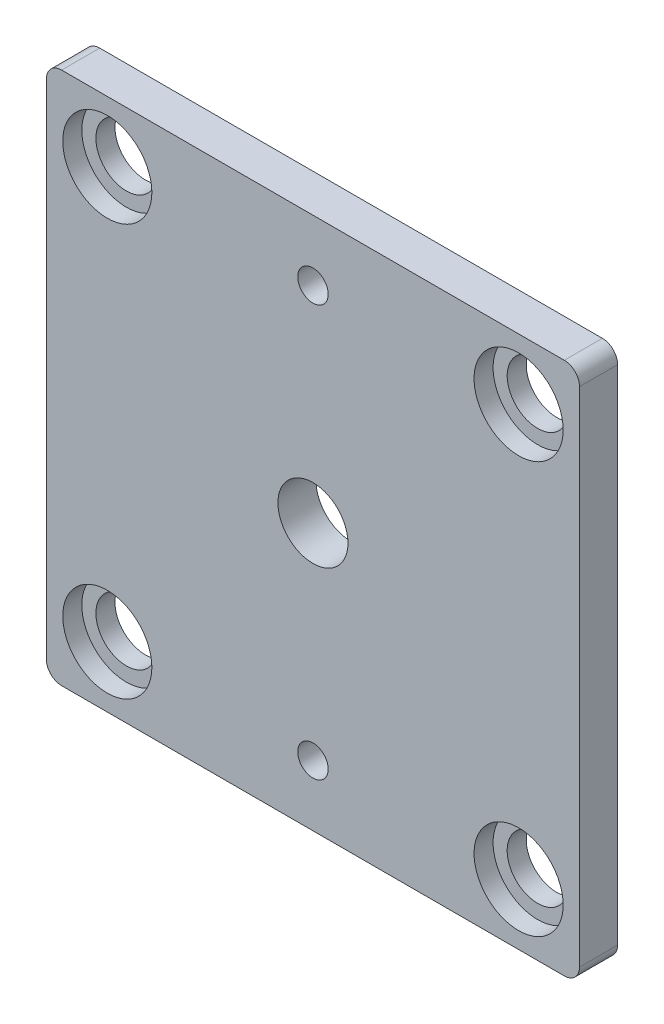
ISO-10303-21;
HEADER;
FILE_DESCRIPTION(('STEP AP214'),'2;1');
FILE_NAME('part.step','',(''),(''),'','','');
FILE_SCHEMA(('AUTOMOTIVE_DESIGN { 1 0 10303 214 1 1 1 1 }'));
ENDSEC;
DATA;
#1=APPLICATION_CONTEXT('core data for automotive mechanical design processes');
#2=APPLICATION_PROTOCOL_DEFINITION('international standard','automotive_design',2000,#1);
#3=PRODUCT_CONTEXT('',#1,'mechanical');
#4=PRODUCT('Part','Part','',(#3));
#5=PRODUCT_RELATED_PRODUCT_CATEGORY('part','',(#4));
#6=PRODUCT_DEFINITION_FORMATION('','',#4);
#7=PRODUCT_DEFINITION_CONTEXT('part definition',#1,'design');
#8=PRODUCT_DEFINITION('design','',#6,#7);
#9=PRODUCT_DEFINITION_SHAPE('','',#8);
#10=(LENGTH_UNIT() NAMED_UNIT(*) SI_UNIT(.MILLI.,.METRE.));
#11=(NAMED_UNIT(*) PLANE_ANGLE_UNIT() SI_UNIT($,.RADIAN.));
#12=(NAMED_UNIT(*) SI_UNIT($,.STERADIAN.) SOLID_ANGLE_UNIT());
#13=UNCERTAINTY_MEASURE_WITH_UNIT(LENGTH_MEASURE(1.E-05),#10,'distance_accuracy_value','');
#14=(GEOMETRIC_REPRESENTATION_CONTEXT(3) GLOBAL_UNCERTAINTY_ASSIGNED_CONTEXT((#13)) GLOBAL_UNIT_ASSIGNED_CONTEXT((#10,
#11,#12)) REPRESENTATION_CONTEXT('',''));
#15=CARTESIAN_POINT('',(0.,0.,0.));
#16=DIRECTION('',(0.,0.,1.));
#17=DIRECTION('',(1.,0.,0.));
#18=AXIS2_PLACEMENT_3D('',#15,#16,#17);
#19=CARTESIAN_POINT('',(-27.,27.,5.));
#20=DIRECTION('',(0.,0.,-1.));
#21=DIRECTION('',(-1.,0.,0.));
#22=AXIS2_PLACEMENT_3D('',#19,#20,#21);
#23=CYLINDRICAL_SURFACE('',#22,4.);
#24=CARTESIAN_POINT('',(-27.,27.,0.));
#25=DIRECTION('',(0.,0.,1.));
#26=DIRECTION('',(1.,0.,0.));
#27=AXIS2_PLACEMENT_3D('',#24,#25,#26);
#28=CIRCLE('',#27,4.);
#29=CARTESIAN_POINT('',(-23.,27.,0.));
#30=VERTEX_POINT('',#29);
#31=EDGE_CURVE('E219',#30,#30,#28,.T.);
#32=ORIENTED_EDGE('',*,*,#31,.F.);
#33=EDGE_LOOP('',(#32));
#34=FACE_BOUND('',#33,.T.);
#35=CARTESIAN_POINT('',(-27.,27.,2.5));
#36=DIRECTION('',(0.,0.,1.));
#37=DIRECTION('',(1.,0.,0.));
#38=AXIS2_PLACEMENT_3D('',#35,#36,#37);
#39=CIRCLE('',#38,4.);
#40=CARTESIAN_POINT('',(-23.,27.,2.5));
#41=VERTEX_POINT('',#40);
#42=EDGE_CURVE('E43',#41,#41,#39,.T.);
#43=ORIENTED_EDGE('',*,*,#42,.T.);
#44=EDGE_LOOP('',(#43));
#45=FACE_BOUND('',#44,.T.);
#46=ADVANCED_FACE('F39',(#34,#45),#23,.F.);
#47=CARTESIAN_POINT('',(27.,27.,5.));
#48=DIRECTION('',(0.,0.,-1.));
#49=DIRECTION('',(-1.,0.,0.));
#50=AXIS2_PLACEMENT_3D('',#47,#48,#49);
#51=CYLINDRICAL_SURFACE('',#50,4.);
#52=CARTESIAN_POINT('',(27.,27.,0.));
#53=DIRECTION('',(0.,0.,1.));
#54=DIRECTION('',(1.,0.,0.));
#55=AXIS2_PLACEMENT_3D('',#52,#53,#54);
#56=CIRCLE('',#55,4.);
#57=CARTESIAN_POINT('',(31.,27.,0.));
#58=VERTEX_POINT('',#57);
#59=EDGE_CURVE('E210',#58,#58,#56,.T.);
#60=ORIENTED_EDGE('',*,*,#59,.F.);
#61=EDGE_LOOP('',(#60));
#62=FACE_BOUND('',#61,.T.);
#63=CARTESIAN_POINT('',(27.,27.,2.5));
#64=DIRECTION('',(0.,0.,1.));
#65=DIRECTION('',(1.,0.,0.));
#66=AXIS2_PLACEMENT_3D('',#63,#64,#65);
#67=CIRCLE('',#66,4.);
#68=CARTESIAN_POINT('',(31.,27.,2.5));
#69=VERTEX_POINT('',#68);
#70=EDGE_CURVE('E192',#69,#69,#67,.T.);
#71=ORIENTED_EDGE('',*,*,#70,.T.);
#72=EDGE_LOOP('',(#71));
#73=FACE_BOUND('',#72,.T.);
#74=ADVANCED_FACE('F287',(#62,#73),#51,.F.);
#75=CARTESIAN_POINT('',(27.,-27.,5.));
#76=DIRECTION('',(0.,0.,-1.));
#77=DIRECTION('',(-1.,0.,0.));
#78=AXIS2_PLACEMENT_3D('',#75,#76,#77);
#79=CYLINDRICAL_SURFACE('',#78,4.);
#80=CARTESIAN_POINT('',(27.,-27.,0.));
#81=DIRECTION('',(0.,0.,1.));
#82=DIRECTION('',(1.,0.,0.));
#83=AXIS2_PLACEMENT_3D('',#80,#81,#82);
#84=CIRCLE('',#83,4.);
#85=CARTESIAN_POINT('',(31.,-27.,0.));
#86=VERTEX_POINT('',#85);
#87=EDGE_CURVE('E204',#86,#86,#84,.T.);
#88=ORIENTED_EDGE('',*,*,#87,.F.);
#89=EDGE_LOOP('',(#88));
#90=FACE_BOUND('',#89,.T.);
#91=CARTESIAN_POINT('',(27.,-27.,2.5));
#92=DIRECTION('',(0.,0.,1.));
#93=DIRECTION('',(1.,0.,0.));
#94=AXIS2_PLACEMENT_3D('',#91,#92,#93);
#95=CIRCLE('',#94,4.);
#96=CARTESIAN_POINT('',(31.,-27.,2.5));
#97=VERTEX_POINT('',#96);
#98=EDGE_CURVE('E188',#97,#97,#95,.T.);
#99=ORIENTED_EDGE('',*,*,#98,.T.);
#100=EDGE_LOOP('',(#99));
#101=FACE_BOUND('',#100,.T.);
#102=ADVANCED_FACE('F293',(#90,#101),#79,.F.);
#103=CARTESIAN_POINT('',(-27.,-27.,5.));
#104=DIRECTION('',(0.,0.,-1.));
#105=DIRECTION('',(-1.,0.,0.));
#106=AXIS2_PLACEMENT_3D('',#103,#104,#105);
#107=CYLINDRICAL_SURFACE('',#106,4.);
#108=CARTESIAN_POINT('',(-27.,-27.,0.));
#109=DIRECTION('',(0.,0.,1.));
#110=DIRECTION('',(1.,0.,0.));
#111=AXIS2_PLACEMENT_3D('',#108,#109,#110);
#112=CIRCLE('',#111,4.);
#113=CARTESIAN_POINT('',(-23.,-27.,0.));
#114=VERTEX_POINT('',#113);
#115=EDGE_CURVE('E199',#114,#114,#112,.T.);
#116=ORIENTED_EDGE('',*,*,#115,.F.);
#117=EDGE_LOOP('',(#116));
#118=FACE_BOUND('',#117,.T.);
#119=CARTESIAN_POINT('',(-27.,-27.,2.5));
#120=DIRECTION('',(0.,0.,1.));
#121=DIRECTION('',(1.,0.,0.));
#122=AXIS2_PLACEMENT_3D('',#119,#120,#121);
#123=CIRCLE('',#122,4.);
#124=CARTESIAN_POINT('',(-23.,-27.,2.5));
#125=VERTEX_POINT('',#124);
#126=EDGE_CURVE('E184',#125,#125,#123,.T.);
#127=ORIENTED_EDGE('',*,*,#126,.T.);
#128=EDGE_LOOP('',(#127));
#129=FACE_BOUND('',#128,.T.);
#130=ADVANCED_FACE('F313',(#118,#129),#107,.F.);
#131=CARTESIAN_POINT('',(0.,0.,5.));
#132=DIRECTION('',(0.,0.,1.));
#133=DIRECTION('',(1.,0.,0.));
#134=AXIS2_PLACEMENT_3D('',#131,#132,#133);
#135=PLANE('',#134);
#136=CARTESIAN_POINT('',(-27.,-27.,5.));
#137=DIRECTION('',(0.,0.,1.));
#138=DIRECTION('',(1.,0.,0.));
#139=AXIS2_PLACEMENT_3D('',#136,#137,#138);
#140=CIRCLE('',#139,5.85);
#141=CARTESIAN_POINT('',(-21.15,-27.,5.));
#142=VERTEX_POINT('',#141);
#143=EDGE_CURVE('E488',#142,#142,#140,.T.);
#144=ORIENTED_EDGE('',*,*,#143,.F.);
#145=EDGE_LOOP('',(#144));
#146=FACE_BOUND('',#145,.T.);
#147=CARTESIAN_POINT('',(27.,-27.,5.));
#148=DIRECTION('',(0.,0.,1.));
#149=DIRECTION('',(1.,0.,0.));
#150=AXIS2_PLACEMENT_3D('',#147,#148,#149);
#151=CIRCLE('',#150,5.85);
#152=CARTESIAN_POINT('',(32.85,-27.,5.));
#153=VERTEX_POINT('',#152);
#154=EDGE_CURVE('E496',#153,#153,#151,.T.);
#155=ORIENTED_EDGE('',*,*,#154,.F.);
#156=EDGE_LOOP('',(#155));
#157=FACE_BOUND('',#156,.T.);
#158=CARTESIAN_POINT('',(27.,27.,5.));
#159=DIRECTION('',(0.,0.,1.));
#160=DIRECTION('',(1.,0.,0.));
#161=AXIS2_PLACEMENT_3D('',#158,#159,#160);
#162=CIRCLE('',#161,5.85);
#163=CARTESIAN_POINT('',(32.85,27.,5.));
#164=VERTEX_POINT('',#163);
#165=EDGE_CURVE('E504',#164,#164,#162,.T.);
#166=ORIENTED_EDGE('',*,*,#165,.F.);
#167=EDGE_LOOP('',(#166));
#168=FACE_BOUND('',#167,.T.);
#169=CARTESIAN_POINT('',(-27.,27.,5.));
#170=DIRECTION('',(0.,0.,1.));
#171=DIRECTION('',(1.,0.,0.));
#172=AXIS2_PLACEMENT_3D('',#169,#170,#171);
#173=CIRCLE('',#172,5.85);
#174=CARTESIAN_POINT('',(-21.15,27.,5.));
#175=VERTEX_POINT('',#174);
#176=EDGE_CURVE('E213',#175,#175,#173,.T.);
#177=ORIENTED_EDGE('',*,*,#176,.F.);
#178=EDGE_LOOP('',(#177));
#179=FACE_BOUND('',#178,.T.);
#180=CARTESIAN_POINT('',(0.,0.,5.));
#181=DIRECTION('',(0.,0.,1.));
#182=DIRECTION('',(1.,0.,0.));
#183=AXIS2_PLACEMENT_3D('',#180,#181,#182);
#184=CIRCLE('',#183,4.6);
#185=CARTESIAN_POINT('',(4.6,0.,5.));
#186=VERTEX_POINT('',#185);
#187=EDGE_CURVE('E232',#186,#186,#184,.T.);
#188=ORIENTED_EDGE('',*,*,#187,.F.);
#189=EDGE_LOOP('',(#188));
#190=FACE_BOUND('',#189,.T.);
#191=DIRECTION('',(0.,-1.,0.));
#192=VECTOR('',#191,1.);
#193=CARTESIAN_POINT('',(-35.,-35.,5.));
#194=LINE('',#193,#192);
#195=CARTESIAN_POINT('',(-35.,33.,5.));
#196=VERTEX_POINT('',#195);
#197=CARTESIAN_POINT('',(-35.,-33.,5.));
#198=VERTEX_POINT('',#197);
#199=EDGE_CURVE('E141',#196,#198,#194,.T.);
#200=ORIENTED_EDGE('',*,*,#199,.T.);
#201=CARTESIAN_POINT('',(-33.,-33.,5.));
#202=DIRECTION('',(0.,0.,1.));
#203=DIRECTION('',(1.,0.,0.));
#204=AXIS2_PLACEMENT_3D('',#201,#202,#203);
#205=CIRCLE('',#204,2.);
#206=CARTESIAN_POINT('',(-33.,-35.,5.));
#207=VERTEX_POINT('',#206);
#208=EDGE_CURVE('E11',#198,#207,#205,.T.);
#209=ORIENTED_EDGE('',*,*,#208,.T.);
#210=DIRECTION('',(1.,0.,0.));
#211=VECTOR('',#210,1.);
#212=CARTESIAN_POINT('',(35.,-35.,5.));
#213=LINE('',#212,#211);
#214=CARTESIAN_POINT('',(33.,-35.,5.));
#215=VERTEX_POINT('',#214);
#216=EDGE_CURVE('E249',#207,#215,#213,.T.);
#217=ORIENTED_EDGE('',*,*,#216,.T.);
#218=CARTESIAN_POINT('',(33.,-33.,5.));
#219=DIRECTION('',(0.,0.,1.));
#220=DIRECTION('',(1.,0.,0.));
#221=AXIS2_PLACEMENT_3D('',#218,#219,#220);
#222=CIRCLE('',#221,2.);
#223=CARTESIAN_POINT('',(35.,-33.,5.));
#224=VERTEX_POINT('',#223);
#225=EDGE_CURVE('E162',#215,#224,#222,.T.);
#226=ORIENTED_EDGE('',*,*,#225,.T.);
#227=DIRECTION('',(0.,1.,0.));
#228=VECTOR('',#227,1.);
#229=CARTESIAN_POINT('',(35.,-35.,5.));
#230=LINE('',#229,#228);
#231=CARTESIAN_POINT('',(35.,33.,5.));
#232=VERTEX_POINT('',#231);
#233=EDGE_CURVE('E126',#224,#232,#230,.T.);
#234=ORIENTED_EDGE('',*,*,#233,.T.);
#235=CARTESIAN_POINT('',(33.,33.,5.));
#236=DIRECTION('',(0.,0.,1.));
#237=DIRECTION('',(1.,0.,0.));
#238=AXIS2_PLACEMENT_3D('',#235,#236,#237);
#239=CIRCLE('',#238,2.);
#240=CARTESIAN_POINT('',(33.,35.,5.));
#241=VERTEX_POINT('',#240);
#242=EDGE_CURVE('E159',#232,#241,#239,.T.);
#243=ORIENTED_EDGE('',*,*,#242,.T.);
#244=DIRECTION('',(-1.,0.,0.));
#245=VECTOR('',#244,1.);
#246=CARTESIAN_POINT('',(35.,35.,5.));
#247=LINE('',#246,#245);
#248=CARTESIAN_POINT('',(-33.,35.,5.));
#249=VERTEX_POINT('',#248);
#250=EDGE_CURVE('E148',#241,#249,#247,.T.);
#251=ORIENTED_EDGE('',*,*,#250,.T.);
#252=CARTESIAN_POINT('',(-33.,33.,5.));
#253=DIRECTION('',(0.,0.,1.));
#254=DIRECTION('',(1.,0.,0.));
#255=AXIS2_PLACEMENT_3D('',#252,#253,#254);
#256=CIRCLE('',#255,2.);
#257=EDGE_CURVE('E156',#249,#196,#256,.T.);
#258=ORIENTED_EDGE('',*,*,#257,.T.);
#259=EDGE_LOOP('',(#200,#209,#217,#226,#234,#243,#251,#258));
#260=FACE_BOUND('',#259,.T.);
#261=CARTESIAN_POINT('',(0.,27.,5.));
#262=DIRECTION('',(0.,0.,1.));
#263=DIRECTION('',(1.,0.,0.));
#264=AXIS2_PLACEMENT_3D('',#261,#262,#263);
#265=CIRCLE('',#264,2.);
#266=CARTESIAN_POINT('',(2.,27.,5.));
#267=VERTEX_POINT('',#266);
#268=EDGE_CURVE('E240',#267,#267,#265,.T.);
#269=ORIENTED_EDGE('',*,*,#268,.F.);
#270=EDGE_LOOP('',(#269));
#271=FACE_BOUND('',#270,.T.);
#272=CARTESIAN_POINT('',(0.,-27.,5.));
#273=DIRECTION('',(0.,0.,1.));
#274=DIRECTION('',(1.,0.,0.));
#275=AXIS2_PLACEMENT_3D('',#272,#273,#274);
#276=CIRCLE('',#275,2.);
#277=CARTESIAN_POINT('',(2.,-27.,5.));
#278=VERTEX_POINT('',#277);
#279=EDGE_CURVE('E224',#278,#278,#276,.T.);
#280=ORIENTED_EDGE('',*,*,#279,.F.);
#281=EDGE_LOOP('',(#280));
#282=FACE_BOUND('',#281,.T.);
#283=ADVANCED_FACE('F264',(#146,#157,#168,#179,#190,#260,#271,#282),#135,.T.);
#284=CARTESIAN_POINT('',(0.,0.,0.));
#285=DIRECTION('',(0.,0.,1.));
#286=DIRECTION('',(1.,0.,0.));
#287=AXIS2_PLACEMENT_3D('',#284,#285,#286);
#288=PLANE('',#287);
#289=DIRECTION('',(1.,0.,0.));
#290=VECTOR('',#289,1.);
#291=CARTESIAN_POINT('',(35.,-35.,0.));
#292=LINE('',#291,#290);
#293=CARTESIAN_POINT('',(-33.,-35.,0.));
#294=VERTEX_POINT('',#293);
#295=CARTESIAN_POINT('',(33.,-35.,0.));
#296=VERTEX_POINT('',#295);
#297=EDGE_CURVE('E136',#294,#296,#292,.T.);
#298=ORIENTED_EDGE('',*,*,#297,.F.);
#299=CARTESIAN_POINT('',(-33.,-33.,0.));
#300=DIRECTION('',(0.,0.,1.));
#301=DIRECTION('',(1.,0.,0.));
#302=AXIS2_PLACEMENT_3D('',#299,#300,#301);
#303=CIRCLE('',#302,2.);
#304=CARTESIAN_POINT('',(-35.,-33.,0.));
#305=VERTEX_POINT('',#304);
#306=EDGE_CURVE('E64',#294,#305,#303,.F.);
#307=ORIENTED_EDGE('',*,*,#306,.T.);
#308=DIRECTION('',(0.,-1.,0.));
#309=VECTOR('',#308,1.);
#310=CARTESIAN_POINT('',(-35.,-35.,0.));
#311=LINE('',#310,#309);
#312=CARTESIAN_POINT('',(-35.,33.,0.));
#313=VERTEX_POINT('',#312);
#314=EDGE_CURVE('E143',#313,#305,#311,.T.);
#315=ORIENTED_EDGE('',*,*,#314,.F.);
#316=CARTESIAN_POINT('',(-33.,33.,0.));
#317=DIRECTION('',(0.,0.,1.));
#318=DIRECTION('',(1.,0.,0.));
#319=AXIS2_PLACEMENT_3D('',#316,#317,#318);
#320=CIRCLE('',#319,2.);
#321=CARTESIAN_POINT('',(-33.,35.,0.));
#322=VERTEX_POINT('',#321);
#323=EDGE_CURVE('E128',#313,#322,#320,.F.);
#324=ORIENTED_EDGE('',*,*,#323,.T.);
#325=DIRECTION('',(-1.,0.,0.));
#326=VECTOR('',#325,1.);
#327=CARTESIAN_POINT('',(35.,35.,0.));
#328=LINE('',#327,#326);
#329=CARTESIAN_POINT('',(33.,35.,0.));
#330=VERTEX_POINT('',#329);
#331=EDGE_CURVE('E135',#330,#322,#328,.T.);
#332=ORIENTED_EDGE('',*,*,#331,.F.);
#333=CARTESIAN_POINT('',(33.,33.,0.));
#334=DIRECTION('',(0.,0.,1.));
#335=DIRECTION('',(1.,0.,0.));
#336=AXIS2_PLACEMENT_3D('',#333,#334,#335);
#337=CIRCLE('',#336,2.);
#338=CARTESIAN_POINT('',(35.,33.,0.));
#339=VERTEX_POINT('',#338);
#340=EDGE_CURVE('E117',#330,#339,#337,.F.);
#341=ORIENTED_EDGE('',*,*,#340,.T.);
#342=DIRECTION('',(0.,1.,0.));
#343=VECTOR('',#342,1.);
#344=CARTESIAN_POINT('',(35.,-35.,0.));
#345=LINE('',#344,#343);
#346=CARTESIAN_POINT('',(35.,-33.,0.));
#347=VERTEX_POINT('',#346);
#348=EDGE_CURVE('E123',#347,#339,#345,.T.);
#349=ORIENTED_EDGE('',*,*,#348,.F.);
#350=CARTESIAN_POINT('',(33.,-33.,0.));
#351=DIRECTION('',(0.,0.,1.));
#352=DIRECTION('',(1.,0.,0.));
#353=AXIS2_PLACEMENT_3D('',#350,#351,#352);
#354=CIRCLE('',#353,2.);
#355=EDGE_CURVE('E108',#347,#296,#354,.F.);
#356=ORIENTED_EDGE('',*,*,#355,.T.);
#357=EDGE_LOOP('',(#298,#307,#315,#324,#332,#341,#349,#356));
#358=FACE_BOUND('',#357,.T.);
#359=CARTESIAN_POINT('',(0.,27.,0.));
#360=DIRECTION('',(0.,0.,1.));
#361=DIRECTION('',(1.,0.,0.));
#362=AXIS2_PLACEMENT_3D('',#359,#360,#361);
#363=CIRCLE('',#362,2.);
#364=CARTESIAN_POINT('',(2.,27.,0.));
#365=VERTEX_POINT('',#364);
#366=EDGE_CURVE('E236',#365,#365,#363,.T.);
#367=ORIENTED_EDGE('',*,*,#366,.T.);
#368=EDGE_LOOP('',(#367));
#369=FACE_BOUND('',#368,.T.);
#370=CARTESIAN_POINT('',(0.,0.,0.));
#371=DIRECTION('',(0.,0.,1.));
#372=DIRECTION('',(1.,0.,0.));
#373=AXIS2_PLACEMENT_3D('',#370,#371,#372);
#374=CIRCLE('',#373,4.6);
#375=CARTESIAN_POINT('',(4.6,0.,0.));
#376=VERTEX_POINT('',#375);
#377=EDGE_CURVE('E228',#376,#376,#374,.T.);
#378=ORIENTED_EDGE('',*,*,#377,.T.);
#379=EDGE_LOOP('',(#378));
#380=FACE_BOUND('',#379,.T.);
#381=CARTESIAN_POINT('',(0.,-27.,0.));
#382=DIRECTION('',(0.,0.,1.));
#383=DIRECTION('',(1.,0.,0.));
#384=AXIS2_PLACEMENT_3D('',#381,#382,#383);
#385=CIRCLE('',#384,2.);
#386=CARTESIAN_POINT('',(2.,-27.,0.));
#387=VERTEX_POINT('',#386);
#388=EDGE_CURVE('E223',#387,#387,#385,.T.);
#389=ORIENTED_EDGE('',*,*,#388,.T.);
#390=EDGE_LOOP('',(#389));
#391=FACE_BOUND('',#390,.T.);
#392=ORIENTED_EDGE('',*,*,#31,.T.);
#393=EDGE_LOOP('',(#392));
#394=FACE_BOUND('',#393,.T.);
#395=ORIENTED_EDGE('',*,*,#59,.T.);
#396=EDGE_LOOP('',(#395));
#397=FACE_BOUND('',#396,.T.);
#398=ORIENTED_EDGE('',*,*,#87,.T.);
#399=EDGE_LOOP('',(#398));
#400=FACE_BOUND('',#399,.T.);
#401=ORIENTED_EDGE('',*,*,#115,.T.);
#402=EDGE_LOOP('',(#401));
#403=FACE_BOUND('',#402,.T.);
#404=ADVANCED_FACE('F131',(#358,#369,#380,#391,#394,#397,#400,#403),#288,.F.);
#405=CARTESIAN_POINT('',(-35.,-35.,5.));
#406=DIRECTION('',(1.,0.,0.));
#407=DIRECTION('',(0.,0.,-1.));
#408=AXIS2_PLACEMENT_3D('',#405,#406,#407);
#409=PLANE('',#408);
#410=ORIENTED_EDGE('',*,*,#314,.T.);
#411=DIRECTION('',(0.,0.,-1.));
#412=VECTOR('',#411,1.);
#413=CARTESIAN_POINT('',(-35.,-33.,5.));
#414=LINE('',#413,#412);
#415=EDGE_CURVE('E49',#305,#198,#414,.F.);
#416=ORIENTED_EDGE('',*,*,#415,.T.);
#417=ORIENTED_EDGE('',*,*,#199,.F.);
#418=DIRECTION('',(0.,0.,-1.));
#419=VECTOR('',#418,1.);
#420=CARTESIAN_POINT('',(-35.,33.,5.));
#421=LINE('',#420,#419);
#422=EDGE_CURVE('E172',#196,#313,#421,.T.);
#423=ORIENTED_EDGE('',*,*,#422,.T.);
#424=EDGE_LOOP('',(#410,#416,#417,#423));
#425=FACE_BOUND('',#424,.T.);
#426=ADVANCED_FACE('F257',(#425),#409,.F.);
#427=CARTESIAN_POINT('',(35.,-35.,5.));
#428=DIRECTION('',(0.,1.,0.));
#429=DIRECTION('',(-1.,0.,0.));
#430=AXIS2_PLACEMENT_3D('',#427,#428,#429);
#431=PLANE('',#430);
#432=ORIENTED_EDGE('',*,*,#216,.F.);
#433=DIRECTION('',(0.,0.,-1.));
#434=VECTOR('',#433,1.);
#435=CARTESIAN_POINT('',(-33.,-35.,5.));
#436=LINE('',#435,#434);
#437=EDGE_CURVE('E176',#207,#294,#436,.T.);
#438=ORIENTED_EDGE('',*,*,#437,.T.);
#439=ORIENTED_EDGE('',*,*,#297,.T.);
#440=DIRECTION('',(0.,0.,-1.));
#441=VECTOR('',#440,1.);
#442=CARTESIAN_POINT('',(33.,-35.,5.));
#443=LINE('',#442,#441);
#444=EDGE_CURVE('E114',#296,#215,#443,.F.);
#445=ORIENTED_EDGE('',*,*,#444,.T.);
#446=EDGE_LOOP('',(#432,#438,#439,#445));
#447=FACE_BOUND('',#446,.T.);
#448=ADVANCED_FACE('F267',(#447),#431,.F.);
#449=CARTESIAN_POINT('',(35.,-35.,5.));
#450=DIRECTION('',(-1.,0.,0.));
#451=DIRECTION('',(0.,0.,1.));
#452=AXIS2_PLACEMENT_3D('',#449,#450,#451);
#453=PLANE('',#452);
#454=ORIENTED_EDGE('',*,*,#233,.F.);
#455=DIRECTION('',(0.,0.,-1.));
#456=VECTOR('',#455,1.);
#457=CARTESIAN_POINT('',(35.,-33.,5.));
#458=LINE('',#457,#456);
#459=EDGE_CURVE('E112',#224,#347,#458,.T.);
#460=ORIENTED_EDGE('',*,*,#459,.T.);
#461=ORIENTED_EDGE('',*,*,#348,.T.);
#462=DIRECTION('',(0.,0.,-1.));
#463=VECTOR('',#462,1.);
#464=CARTESIAN_POINT('',(35.,33.,5.));
#465=LINE('',#464,#463);
#466=EDGE_CURVE('E129',#339,#232,#465,.F.);
#467=ORIENTED_EDGE('',*,*,#466,.T.);
#468=EDGE_LOOP('',(#454,#460,#461,#467));
#469=FACE_BOUND('',#468,.T.);
#470=ADVANCED_FACE('F122',(#469),#453,.F.);
#471=CARTESIAN_POINT('',(35.,35.,5.));
#472=DIRECTION('',(0.,-1.,0.));
#473=DIRECTION('',(1.,0.,0.));
#474=AXIS2_PLACEMENT_3D('',#471,#472,#473);
#475=PLANE('',#474);
#476=ORIENTED_EDGE('',*,*,#250,.F.);
#477=DIRECTION('',(0.,0.,-1.));
#478=VECTOR('',#477,1.);
#479=CARTESIAN_POINT('',(33.,35.,5.));
#480=LINE('',#479,#478);
#481=EDGE_CURVE('E168',#241,#330,#480,.T.);
#482=ORIENTED_EDGE('',*,*,#481,.T.);
#483=ORIENTED_EDGE('',*,*,#331,.T.);
#484=DIRECTION('',(0.,0.,-1.));
#485=VECTOR('',#484,1.);
#486=CARTESIAN_POINT('',(-33.,35.,5.));
#487=LINE('',#486,#485);
#488=EDGE_CURVE('E165',#322,#249,#487,.F.);
#489=ORIENTED_EDGE('',*,*,#488,.T.);
#490=EDGE_LOOP('',(#476,#482,#483,#489));
#491=FACE_BOUND('',#490,.T.);
#492=ADVANCED_FACE('F274',(#491),#475,.F.);
#493=CARTESIAN_POINT('',(0.,27.,5.));
#494=DIRECTION('',(0.,0.,-1.));
#495=DIRECTION('',(-1.,0.,0.));
#496=AXIS2_PLACEMENT_3D('',#493,#494,#495);
#497=CYLINDRICAL_SURFACE('',#496,2.);
#498=ORIENTED_EDGE('',*,*,#268,.T.);
#499=EDGE_LOOP('',(#498));
#500=FACE_BOUND('',#499,.T.);
#501=ORIENTED_EDGE('',*,*,#366,.F.);
#502=EDGE_LOOP('',(#501));
#503=FACE_BOUND('',#502,.T.);
#504=ADVANCED_FACE('F306',(#500,#503),#497,.F.);
#505=CARTESIAN_POINT('',(0.,0.,5.));
#506=DIRECTION('',(0.,0.,-1.));
#507=DIRECTION('',(-1.,0.,0.));
#508=AXIS2_PLACEMENT_3D('',#505,#506,#507);
#509=CYLINDRICAL_SURFACE('',#508,4.6);
#510=ORIENTED_EDGE('',*,*,#187,.T.);
#511=EDGE_LOOP('',(#510));
#512=FACE_BOUND('',#511,.T.);
#513=ORIENTED_EDGE('',*,*,#377,.F.);
#514=EDGE_LOOP('',(#513));
#515=FACE_BOUND('',#514,.T.);
#516=ADVANCED_FACE('F302',(#512,#515),#509,.F.);
#517=CARTESIAN_POINT('',(0.,-27.,5.));
#518=DIRECTION('',(0.,0.,-1.));
#519=DIRECTION('',(-1.,0.,0.));
#520=AXIS2_PLACEMENT_3D('',#517,#518,#519);
#521=CYLINDRICAL_SURFACE('',#520,2.);
#522=ORIENTED_EDGE('',*,*,#279,.T.);
#523=EDGE_LOOP('',(#522));
#524=FACE_BOUND('',#523,.T.);
#525=ORIENTED_EDGE('',*,*,#388,.F.);
#526=EDGE_LOOP('',(#525));
#527=FACE_BOUND('',#526,.T.);
#528=ADVANCED_FACE('F299',(#524,#527),#521,.F.);
#529=CARTESIAN_POINT('',(33.,-33.,5.));
#530=DIRECTION('',(0.,0.,-1.));
#531=DIRECTION('',(-1.,0.,0.));
#532=AXIS2_PLACEMENT_3D('',#529,#530,#531);
#533=CYLINDRICAL_SURFACE('',#532,2.);
#534=ORIENTED_EDGE('',*,*,#225,.F.);
#535=ORIENTED_EDGE('',*,*,#444,.F.);
#536=ORIENTED_EDGE('',*,*,#355,.F.);
#537=ORIENTED_EDGE('',*,*,#459,.F.);
#538=EDGE_LOOP('',(#534,#535,#536,#537));
#539=FACE_BOUND('',#538,.T.);
#540=ADVANCED_FACE('F111',(#539),#533,.T.);
#541=CARTESIAN_POINT('',(33.,33.,5.));
#542=DIRECTION('',(0.,0.,-1.));
#543=DIRECTION('',(-1.,0.,0.));
#544=AXIS2_PLACEMENT_3D('',#541,#542,#543);
#545=CYLINDRICAL_SURFACE('',#544,2.);
#546=ORIENTED_EDGE('',*,*,#242,.F.);
#547=ORIENTED_EDGE('',*,*,#466,.F.);
#548=ORIENTED_EDGE('',*,*,#340,.F.);
#549=ORIENTED_EDGE('',*,*,#481,.F.);
#550=EDGE_LOOP('',(#546,#547,#548,#549));
#551=FACE_BOUND('',#550,.T.);
#552=ADVANCED_FACE('F272',(#551),#545,.T.);
#553=CARTESIAN_POINT('',(-33.,33.,5.));
#554=DIRECTION('',(0.,0.,-1.));
#555=DIRECTION('',(-1.,0.,0.));
#556=AXIS2_PLACEMENT_3D('',#553,#554,#555);
#557=CYLINDRICAL_SURFACE('',#556,2.);
#558=ORIENTED_EDGE('',*,*,#257,.F.);
#559=ORIENTED_EDGE('',*,*,#488,.F.);
#560=ORIENTED_EDGE('',*,*,#323,.F.);
#561=ORIENTED_EDGE('',*,*,#422,.F.);
#562=EDGE_LOOP('',(#558,#559,#560,#561));
#563=FACE_BOUND('',#562,.T.);
#564=ADVANCED_FACE('F278',(#563),#557,.T.);
#565=CARTESIAN_POINT('',(-33.,-33.,5.));
#566=DIRECTION('',(0.,0.,-1.));
#567=DIRECTION('',(-1.,0.,0.));
#568=AXIS2_PLACEMENT_3D('',#565,#566,#567);
#569=CYLINDRICAL_SURFACE('',#568,2.);
#570=ORIENTED_EDGE('',*,*,#208,.F.);
#571=ORIENTED_EDGE('',*,*,#415,.F.);
#572=ORIENTED_EDGE('',*,*,#306,.F.);
#573=ORIENTED_EDGE('',*,*,#437,.F.);
#574=EDGE_LOOP('',(#570,#571,#572,#573));
#575=FACE_BOUND('',#574,.T.);
#576=ADVANCED_FACE('F41',(#575),#569,.T.);
#577=CARTESIAN_POINT('',(-27.,-27.,2.5));
#578=DIRECTION('',(0.,0.,1.));
#579=DIRECTION('',(1.,0.,0.));
#580=AXIS2_PLACEMENT_3D('',#577,#578,#579);
#581=CYLINDRICAL_SURFACE('',#580,5.85);
#582=CARTESIAN_POINT('',(-27.,-27.,2.5));
#583=DIRECTION('',(0.,0.,1.));
#584=DIRECTION('',(1.,0.,0.));
#585=AXIS2_PLACEMENT_3D('',#582,#583,#584);
#586=CIRCLE('',#585,5.85);
#587=CARTESIAN_POINT('',(-21.15,-27.,2.5));
#588=VERTEX_POINT('',#587);
#589=EDGE_CURVE('E492',#588,#588,#586,.T.);
#590=ORIENTED_EDGE('',*,*,#589,.F.);
#591=EDGE_LOOP('',(#590));
#592=FACE_BOUND('',#591,.T.);
#593=ORIENTED_EDGE('',*,*,#143,.T.);
#594=EDGE_LOOP('',(#593));
#595=FACE_BOUND('',#594,.T.);
#596=ADVANCED_FACE('F284',(#592,#595),#581,.F.);
#597=CARTESIAN_POINT('',(-27.,-27.,2.5));
#598=DIRECTION('',(0.,0.,1.));
#599=DIRECTION('',(1.,0.,0.));
#600=AXIS2_PLACEMENT_3D('',#597,#598,#599);
#601=PLANE('',#600);
#602=ORIENTED_EDGE('',*,*,#126,.F.);
#603=EDGE_LOOP('',(#602));
#604=FACE_BOUND('',#603,.T.);
#605=ORIENTED_EDGE('',*,*,#589,.T.);
#606=EDGE_LOOP('',(#605));
#607=FACE_BOUND('',#606,.T.);
#608=ADVANCED_FACE('F406',(#604,#607),#601,.T.);
#609=CARTESIAN_POINT('',(27.,-27.,2.5));
#610=DIRECTION('',(0.,0.,1.));
#611=DIRECTION('',(1.,0.,0.));
#612=AXIS2_PLACEMENT_3D('',#609,#610,#611);
#613=CYLINDRICAL_SURFACE('',#612,5.85);
#614=CARTESIAN_POINT('',(27.,-27.,2.5));
#615=DIRECTION('',(0.,0.,1.));
#616=DIRECTION('',(1.,0.,0.));
#617=AXIS2_PLACEMENT_3D('',#614,#615,#616);
#618=CIRCLE('',#617,5.85);
#619=CARTESIAN_POINT('',(32.85,-27.,2.5));
#620=VERTEX_POINT('',#619);
#621=EDGE_CURVE('E500',#620,#620,#618,.T.);
#622=ORIENTED_EDGE('',*,*,#621,.F.);
#623=EDGE_LOOP('',(#622));
#624=FACE_BOUND('',#623,.T.);
#625=ORIENTED_EDGE('',*,*,#154,.T.);
#626=EDGE_LOOP('',(#625));
#627=FACE_BOUND('',#626,.T.);
#628=ADVANCED_FACE('F416',(#624,#627),#613,.F.);
#629=CARTESIAN_POINT('',(27.,-27.,2.5));
#630=DIRECTION('',(0.,0.,1.));
#631=DIRECTION('',(1.,0.,0.));
#632=AXIS2_PLACEMENT_3D('',#629,#630,#631);
#633=PLANE('',#632);
#634=ORIENTED_EDGE('',*,*,#98,.F.);
#635=EDGE_LOOP('',(#634));
#636=FACE_BOUND('',#635,.T.);
#637=ORIENTED_EDGE('',*,*,#621,.T.);
#638=EDGE_LOOP('',(#637));
#639=FACE_BOUND('',#638,.T.);
#640=ADVANCED_FACE('F426',(#636,#639),#633,.T.);
#641=CARTESIAN_POINT('',(27.,27.,2.5));
#642=DIRECTION('',(0.,0.,1.));
#643=DIRECTION('',(1.,0.,0.));
#644=AXIS2_PLACEMENT_3D('',#641,#642,#643);
#645=CYLINDRICAL_SURFACE('',#644,5.85);
#646=CARTESIAN_POINT('',(27.,27.,2.5));
#647=DIRECTION('',(0.,0.,1.));
#648=DIRECTION('',(1.,0.,0.));
#649=AXIS2_PLACEMENT_3D('',#646,#647,#648);
#650=CIRCLE('',#649,5.85);
#651=CARTESIAN_POINT('',(32.85,27.,2.5));
#652=VERTEX_POINT('',#651);
#653=EDGE_CURVE('E486',#652,#652,#650,.T.);
#654=ORIENTED_EDGE('',*,*,#653,.F.);
#655=EDGE_LOOP('',(#654));
#656=FACE_BOUND('',#655,.T.);
#657=ORIENTED_EDGE('',*,*,#165,.T.);
#658=EDGE_LOOP('',(#657));
#659=FACE_BOUND('',#658,.T.);
#660=ADVANCED_FACE('F436',(#656,#659),#645,.F.);
#661=CARTESIAN_POINT('',(27.,27.,2.5));
#662=DIRECTION('',(0.,0.,1.));
#663=DIRECTION('',(1.,0.,0.));
#664=AXIS2_PLACEMENT_3D('',#661,#662,#663);
#665=PLANE('',#664);
#666=ORIENTED_EDGE('',*,*,#70,.F.);
#667=EDGE_LOOP('',(#666));
#668=FACE_BOUND('',#667,.T.);
#669=ORIENTED_EDGE('',*,*,#653,.T.);
#670=EDGE_LOOP('',(#669));
#671=FACE_BOUND('',#670,.T.);
#672=ADVANCED_FACE('F446',(#668,#671),#665,.T.);
#673=CARTESIAN_POINT('',(-27.,27.,2.5));
#674=DIRECTION('',(0.,0.,1.));
#675=DIRECTION('',(1.,0.,0.));
#676=AXIS2_PLACEMENT_3D('',#673,#674,#675);
#677=CYLINDRICAL_SURFACE('',#676,5.85);
#678=CARTESIAN_POINT('',(-27.,27.,2.5));
#679=DIRECTION('',(0.,0.,1.));
#680=DIRECTION('',(1.,0.,0.));
#681=AXIS2_PLACEMENT_3D('',#678,#679,#680);
#682=CIRCLE('',#681,5.85);
#683=CARTESIAN_POINT('',(-21.15,27.,2.5));
#684=VERTEX_POINT('',#683);
#685=EDGE_CURVE('E189',#684,#684,#682,.T.);
#686=ORIENTED_EDGE('',*,*,#685,.F.);
#687=EDGE_LOOP('',(#686));
#688=FACE_BOUND('',#687,.T.);
#689=ORIENTED_EDGE('',*,*,#176,.T.);
#690=EDGE_LOOP('',(#689));
#691=FACE_BOUND('',#690,.T.);
#692=ADVANCED_FACE('F456',(#688,#691),#677,.F.);
#693=CARTESIAN_POINT('',(-27.,27.,2.5));
#694=DIRECTION('',(0.,0.,1.));
#695=DIRECTION('',(1.,0.,0.));
#696=AXIS2_PLACEMENT_3D('',#693,#694,#695);
#697=PLANE('',#696);
#698=ORIENTED_EDGE('',*,*,#42,.F.);
#699=EDGE_LOOP('',(#698));
#700=FACE_BOUND('',#699,.T.);
#701=ORIENTED_EDGE('',*,*,#685,.T.);
#702=EDGE_LOOP('',(#701));
#703=FACE_BOUND('',#702,.T.);
#704=ADVANCED_FACE('F466',(#700,#703),#697,.T.);
#705=CLOSED_SHELL('',(#46,#74,#102,#130,#283,#404,#426,#448,#470,#492,#504,#516,#528,#540,#552,
#564,#576,#596,#608,#628,#640,#660,#672,#692,#704));
#706=MANIFOLD_SOLID_BREP('B2',#705);
#707=ADVANCED_BREP_SHAPE_REPRESENTATION('',(#18,#706),#14);
#708=SHAPE_DEFINITION_REPRESENTATION(#9,#707);
ENDSEC;
END-ISO-10303-21;
